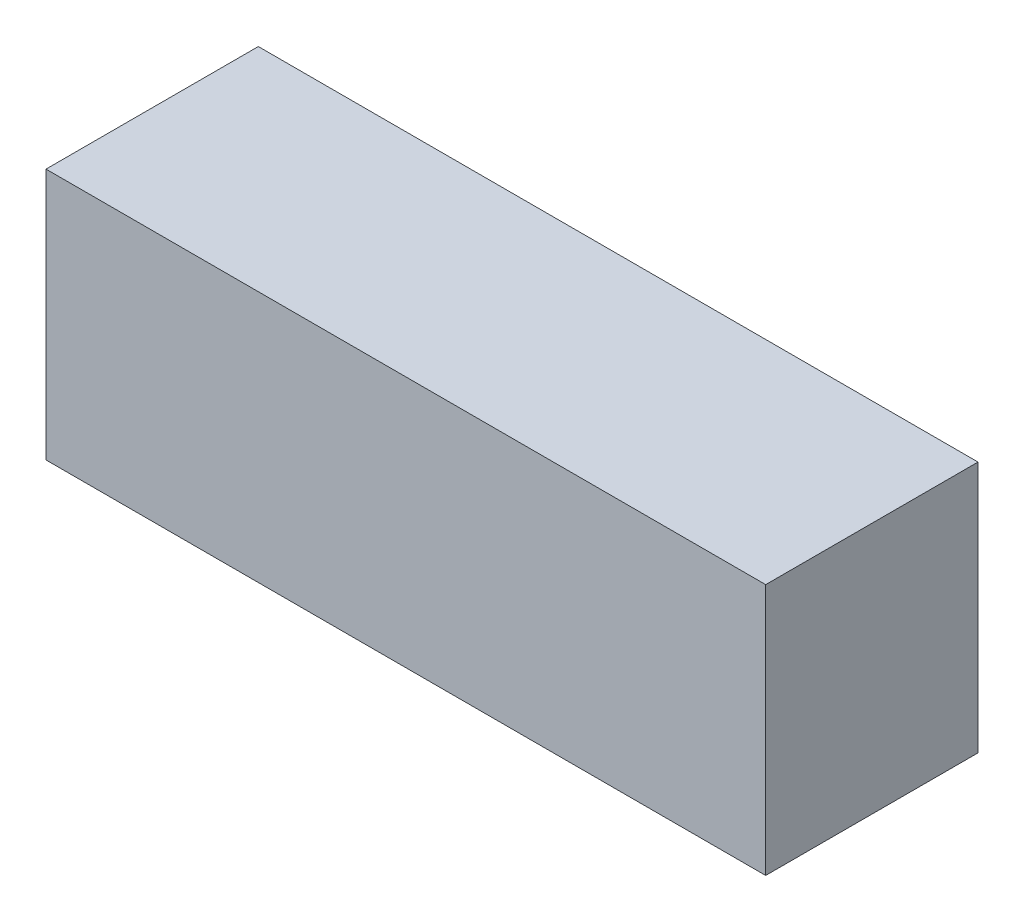
ISO-10303-21;
HEADER;
FILE_DESCRIPTION(('STEP AP214'),'2;1');
FILE_NAME('part.step','',(''),(''),'','','');
FILE_SCHEMA(('AUTOMOTIVE_DESIGN { 1 0 10303 214 1 1 1 1 }'));
ENDSEC;
DATA;
#1=APPLICATION_CONTEXT('core data for automotive mechanical design processes');
#2=APPLICATION_PROTOCOL_DEFINITION('international standard','automotive_design',2000,#1);
#3=PRODUCT_CONTEXT('',#1,'mechanical');
#4=PRODUCT('Part','Part','',(#3));
#5=PRODUCT_RELATED_PRODUCT_CATEGORY('part','',(#4));
#6=PRODUCT_DEFINITION_FORMATION('','',#4);
#7=PRODUCT_DEFINITION_CONTEXT('part definition',#1,'design');
#8=PRODUCT_DEFINITION('design','',#6,#7);
#9=PRODUCT_DEFINITION_SHAPE('','',#8);
#10=(LENGTH_UNIT() NAMED_UNIT(*) SI_UNIT(.MILLI.,.METRE.));
#11=(NAMED_UNIT(*) PLANE_ANGLE_UNIT() SI_UNIT($,.RADIAN.));
#12=(NAMED_UNIT(*) SI_UNIT($,.STERADIAN.) SOLID_ANGLE_UNIT());
#13=UNCERTAINTY_MEASURE_WITH_UNIT(LENGTH_MEASURE(1.E-05),#10,'distance_accuracy_value','');
#14=(GEOMETRIC_REPRESENTATION_CONTEXT(3) GLOBAL_UNCERTAINTY_ASSIGNED_CONTEXT((#13)) GLOBAL_UNIT_ASSIGNED_CONTEXT((#10,
#11,#12)) REPRESENTATION_CONTEXT('',''));
#15=CARTESIAN_POINT('',(0.,0.,0.));
#16=DIRECTION('',(0.,0.,1.));
#17=DIRECTION('',(1.,0.,0.));
#18=AXIS2_PLACEMENT_3D('',#15,#16,#17);
#19=CARTESIAN_POINT('',(-60.6361380554929,70.,59.));
#20=DIRECTION('',(0.,-1.,0.));
#21=DIRECTION('',(0.,0.,-1.));
#22=AXIS2_PLACEMENT_3D('',#19,#20,#21);
#23=PLANE('',#22);
#24=DIRECTION('',(-1.,0.,0.));
#25=VECTOR('',#24,1.);
#26=CARTESIAN_POINT('',(-60.6361380554929,70.,0.));
#27=LINE('',#26,#25);
#28=CARTESIAN_POINT('',(139.363861944507,70.,0.));
#29=VERTEX_POINT('',#28);
#30=CARTESIAN_POINT('',(-60.6361380554929,70.,0.));
#31=VERTEX_POINT('',#30);
#32=EDGE_CURVE('E179',#29,#31,#27,.T.);
#33=ORIENTED_EDGE('',*,*,#32,.T.);
#34=DIRECTION('',(0.,0.,-1.));
#35=VECTOR('',#34,1.);
#36=CARTESIAN_POINT('',(-60.6361380554929,70.,59.));
#37=LINE('',#36,#35);
#38=CARTESIAN_POINT('',(-60.6361380554929,70.,59.));
#39=VERTEX_POINT('',#38);
#40=EDGE_CURVE('E11',#39,#31,#37,.T.);
#41=ORIENTED_EDGE('',*,*,#40,.F.);
#42=DIRECTION('',(-1.,0.,0.));
#43=VECTOR('',#42,1.);
#44=CARTESIAN_POINT('',(-60.6361380554929,70.,59.));
#45=LINE('',#44,#43);
#46=CARTESIAN_POINT('',(139.363861944507,70.,59.));
#47=VERTEX_POINT('',#46);
#48=EDGE_CURVE('E227',#47,#39,#45,.T.);
#49=ORIENTED_EDGE('',*,*,#48,.F.);
#50=DIRECTION('',(0.,0.,-1.));
#51=VECTOR('',#50,1.);
#52=CARTESIAN_POINT('',(139.363861944507,70.,59.));
#53=LINE('',#52,#51);
#54=EDGE_CURVE('E241',#47,#29,#53,.T.);
#55=ORIENTED_EDGE('',*,*,#54,.T.);
#56=EDGE_LOOP('',(#33,#41,#49,#55));
#57=FACE_BOUND('',#56,.T.);
#58=ADVANCED_FACE('F45',(#57),#23,.F.);
#59=CARTESIAN_POINT('',(-60.6361380554929,70.,59.));
#60=DIRECTION('',(1.,0.,0.));
#61=DIRECTION('',(0.,1.,0.));
#62=AXIS2_PLACEMENT_3D('',#59,#60,#61);
#63=PLANE('',#62);
#64=DIRECTION('',(0.,-1.,0.));
#65=VECTOR('',#64,1.);
#66=CARTESIAN_POINT('',(-60.6361380554929,70.,0.));
#67=LINE('',#66,#65);
#68=CARTESIAN_POINT('',(-60.6361380554929,0.,0.));
#69=VERTEX_POINT('',#68);
#70=EDGE_CURVE('E245',#31,#69,#67,.T.);
#71=ORIENTED_EDGE('',*,*,#70,.T.);
#72=DIRECTION('',(0.,0.,-1.));
#73=VECTOR('',#72,1.);
#74=CARTESIAN_POINT('',(-60.6361380554929,0.,59.));
#75=LINE('',#74,#73);
#76=CARTESIAN_POINT('',(-60.6361380554929,0.,59.));
#77=VERTEX_POINT('',#76);
#78=EDGE_CURVE('E53',#77,#69,#75,.T.);
#79=ORIENTED_EDGE('',*,*,#78,.F.);
#80=DIRECTION('',(0.,-1.,0.));
#81=VECTOR('',#80,1.);
#82=CARTESIAN_POINT('',(-60.6361380554929,70.,59.));
#83=LINE('',#82,#81);
#84=EDGE_CURVE('E231',#39,#77,#83,.T.);
#85=ORIENTED_EDGE('',*,*,#84,.F.);
#86=ORIENTED_EDGE('',*,*,#40,.T.);
#87=EDGE_LOOP('',(#71,#79,#85,#86));
#88=FACE_BOUND('',#87,.T.);
#89=ADVANCED_FACE('F281',(#88),#63,.F.);
#90=CARTESIAN_POINT('',(-60.6361380554929,0.,59.));
#91=DIRECTION('',(0.,1.,0.));
#92=DIRECTION('',(0.,0.,1.));
#93=AXIS2_PLACEMENT_3D('',#90,#91,#92);
#94=PLANE('',#93);
#95=DIRECTION('',(1.,0.,0.));
#96=VECTOR('',#95,1.);
#97=CARTESIAN_POINT('',(-55.6361380554929,0.,17.185));
#98=LINE('',#97,#96);
#99=CARTESIAN_POINT('',(-55.6361380554929,0.,17.185));
#100=VERTEX_POINT('',#99);
#101=CARTESIAN_POINT('',(-20.6361380554929,0.,17.185));
#102=VERTEX_POINT('',#101);
#103=EDGE_CURVE('E170',#100,#102,#98,.T.);
#104=ORIENTED_EDGE('',*,*,#103,.F.);
#105=DIRECTION('',(0.,0.,-1.));
#106=VECTOR('',#105,1.);
#107=CARTESIAN_POINT('',(-55.6361380554929,0.,41.815));
#108=LINE('',#107,#106);
#109=CARTESIAN_POINT('',(-55.6361380554929,0.,41.815));
#110=VERTEX_POINT('',#109);
#111=EDGE_CURVE('E60',#110,#100,#108,.T.);
#112=ORIENTED_EDGE('',*,*,#111,.F.);
#113=DIRECTION('',(-1.,0.,0.));
#114=VECTOR('',#113,1.);
#115=CARTESIAN_POINT('',(-55.6361380554929,0.,41.815));
#116=LINE('',#115,#114);
#117=CARTESIAN_POINT('',(-20.6361380554929,0.,41.815));
#118=VERTEX_POINT('',#117);
#119=EDGE_CURVE('E157',#118,#110,#116,.T.);
#120=ORIENTED_EDGE('',*,*,#119,.F.);
#121=DIRECTION('',(0.,0.,1.));
#122=VECTOR('',#121,1.);
#123=CARTESIAN_POINT('',(-20.6361380554929,0.,41.815));
#124=LINE('',#123,#122);
#125=EDGE_CURVE('E161',#102,#118,#124,.T.);
#126=ORIENTED_EDGE('',*,*,#125,.F.);
#127=EDGE_LOOP('',(#104,#112,#120,#126));
#128=FACE_BOUND('',#127,.T.);
#129=DIRECTION('',(-1.,0.,0.));
#130=VECTOR('',#129,1.);
#131=CARTESIAN_POINT('',(134.363861944507,0.,41.815));
#132=LINE('',#131,#130);
#133=CARTESIAN_POINT('',(134.363861944507,0.,41.815));
#134=VERTEX_POINT('',#133);
#135=CARTESIAN_POINT('',(99.3638619445071,0.,41.815));
#136=VERTEX_POINT('',#135);
#137=EDGE_CURVE('E207',#134,#136,#132,.T.);
#138=ORIENTED_EDGE('',*,*,#137,.F.);
#139=DIRECTION('',(0.,0.,1.));
#140=VECTOR('',#139,1.);
#141=CARTESIAN_POINT('',(134.363861944507,0.,41.815));
#142=LINE('',#141,#140);
#143=CARTESIAN_POINT('',(134.363861944507,0.,17.185));
#144=VERTEX_POINT('',#143);
#145=EDGE_CURVE('E68',#144,#134,#142,.T.);
#146=ORIENTED_EDGE('',*,*,#145,.F.);
#147=DIRECTION('',(1.,0.,0.));
#148=VECTOR('',#147,1.);
#149=CARTESIAN_POINT('',(134.363861944507,0.,17.185));
#150=LINE('',#149,#148);
#151=CARTESIAN_POINT('',(99.3638619445071,0.,17.185));
#152=VERTEX_POINT('',#151);
#153=EDGE_CURVE('E198',#152,#144,#150,.T.);
#154=ORIENTED_EDGE('',*,*,#153,.F.);
#155=DIRECTION('',(0.,0.,-1.));
#156=VECTOR('',#155,1.);
#157=CARTESIAN_POINT('',(99.3638619445071,0.,41.815));
#158=LINE('',#157,#156);
#159=EDGE_CURVE('E202',#136,#152,#158,.T.);
#160=ORIENTED_EDGE('',*,*,#159,.F.);
#161=EDGE_LOOP('',(#138,#146,#154,#160));
#162=FACE_BOUND('',#161,.T.);
#163=DIRECTION('',(1.,0.,0.));
#164=VECTOR('',#163,1.);
#165=CARTESIAN_POINT('',(-60.6361380554929,0.,0.));
#166=LINE('',#165,#164);
#167=CARTESIAN_POINT('',(139.363861944507,0.,0.));
#168=VERTEX_POINT('',#167);
#169=EDGE_CURVE('E248',#69,#168,#166,.T.);
#170=ORIENTED_EDGE('',*,*,#169,.T.);
#171=DIRECTION('',(0.,0.,-1.));
#172=VECTOR('',#171,1.);
#173=CARTESIAN_POINT('',(139.363861944507,0.,59.));
#174=LINE('',#173,#172);
#175=CARTESIAN_POINT('',(139.363861944507,0.,59.));
#176=VERTEX_POINT('',#175);
#177=EDGE_CURVE('E256',#176,#168,#174,.T.);
#178=ORIENTED_EDGE('',*,*,#177,.F.);
#179=DIRECTION('',(1.,0.,0.));
#180=VECTOR('',#179,1.);
#181=CARTESIAN_POINT('',(-60.6361380554929,0.,59.));
#182=LINE('',#181,#180);
#183=EDGE_CURVE('E235',#77,#176,#182,.T.);
#184=ORIENTED_EDGE('',*,*,#183,.F.);
#185=ORIENTED_EDGE('',*,*,#78,.T.);
#186=EDGE_LOOP('',(#170,#178,#184,#185));
#187=FACE_BOUND('',#186,.T.);
#188=ADVANCED_FACE('F265',(#128,#162,#187),#94,.F.);
#189=CARTESIAN_POINT('',(139.363861944507,70.,59.));
#190=DIRECTION('',(-1.,0.,0.));
#191=DIRECTION('',(0.,0.,1.));
#192=AXIS2_PLACEMENT_3D('',#189,#190,#191);
#193=PLANE('',#192);
#194=DIRECTION('',(0.,1.,0.));
#195=VECTOR('',#194,1.);
#196=CARTESIAN_POINT('',(139.363861944507,70.,0.));
#197=LINE('',#196,#195);
#198=EDGE_CURVE('E232',#168,#29,#197,.T.);
#199=ORIENTED_EDGE('',*,*,#198,.T.);
#200=ORIENTED_EDGE('',*,*,#54,.F.);
#201=DIRECTION('',(0.,1.,0.));
#202=VECTOR('',#201,1.);
#203=CARTESIAN_POINT('',(139.363861944507,70.,59.));
#204=LINE('',#203,#202);
#205=EDGE_CURVE('E238',#176,#47,#204,.T.);
#206=ORIENTED_EDGE('',*,*,#205,.F.);
#207=ORIENTED_EDGE('',*,*,#177,.T.);
#208=EDGE_LOOP('',(#199,#200,#206,#207));
#209=FACE_BOUND('',#208,.T.);
#210=ADVANCED_FACE('F274',(#209),#193,.F.);
#211=CARTESIAN_POINT('',(0.,0.,59.));
#212=DIRECTION('',(0.,0.,-1.));
#213=DIRECTION('',(-1.,0.,0.));
#214=AXIS2_PLACEMENT_3D('',#211,#212,#213);
#215=PLANE('',#214);
#216=ORIENTED_EDGE('',*,*,#48,.T.);
#217=ORIENTED_EDGE('',*,*,#84,.T.);
#218=ORIENTED_EDGE('',*,*,#183,.T.);
#219=ORIENTED_EDGE('',*,*,#205,.T.);
#220=EDGE_LOOP('',(#216,#217,#218,#219));
#221=FACE_BOUND('',#220,.T.);
#222=ADVANCED_FACE('F280',(#221),#215,.F.);
#223=CARTESIAN_POINT('',(0.,0.,0.));
#224=DIRECTION('',(0.,0.,-1.));
#225=DIRECTION('',(-1.,0.,0.));
#226=AXIS2_PLACEMENT_3D('',#223,#224,#225);
#227=PLANE('',#226);
#228=ORIENTED_EDGE('',*,*,#32,.F.);
#229=ORIENTED_EDGE('',*,*,#198,.F.);
#230=ORIENTED_EDGE('',*,*,#169,.F.);
#231=ORIENTED_EDGE('',*,*,#70,.F.);
#232=EDGE_LOOP('',(#228,#229,#230,#231));
#233=FACE_BOUND('',#232,.T.);
#234=ADVANCED_FACE('F271',(#233),#227,.T.);
#235=CARTESIAN_POINT('',(134.363861944507,20.,41.815));
#236=DIRECTION('',(1.,0.,0.));
#237=DIRECTION('',(0.,0.,-1.));
#238=AXIS2_PLACEMENT_3D('',#235,#236,#237);
#239=PLANE('',#238);
#240=ORIENTED_EDGE('',*,*,#145,.T.);
#241=DIRECTION('',(0.,-1.,0.));
#242=VECTOR('',#241,1.);
#243=CARTESIAN_POINT('',(134.363861944507,20.,41.815));
#244=LINE('',#243,#242);
#245=CARTESIAN_POINT('',(134.363861944507,20.,41.815));
#246=VERTEX_POINT('',#245);
#247=EDGE_CURVE('E185',#246,#134,#244,.T.);
#248=ORIENTED_EDGE('',*,*,#247,.F.);
#249=DIRECTION('',(0.,0.,1.));
#250=VECTOR('',#249,1.);
#251=CARTESIAN_POINT('',(134.363861944507,20.,41.815));
#252=LINE('',#251,#250);
#253=CARTESIAN_POINT('',(134.363861944507,20.,17.185));
#254=VERTEX_POINT('',#253);
#255=EDGE_CURVE('E203',#254,#246,#252,.T.);
#256=ORIENTED_EDGE('',*,*,#255,.F.);
#257=DIRECTION('',(0.,-1.,0.));
#258=VECTOR('',#257,1.);
#259=CARTESIAN_POINT('',(134.363861944507,20.,17.185));
#260=LINE('',#259,#258);
#261=EDGE_CURVE('E195',#254,#144,#260,.T.);
#262=ORIENTED_EDGE('',*,*,#261,.T.);
#263=EDGE_LOOP('',(#240,#248,#256,#262));
#264=FACE_BOUND('',#263,.T.);
#265=ADVANCED_FACE('F294',(#264),#239,.F.);
#266=CARTESIAN_POINT('',(134.363861944507,20.,17.185));
#267=DIRECTION('',(0.,0.,-1.));
#268=DIRECTION('',(-1.,0.,0.));
#269=AXIS2_PLACEMENT_3D('',#266,#267,#268);
#270=PLANE('',#269);
#271=ORIENTED_EDGE('',*,*,#153,.T.);
#272=ORIENTED_EDGE('',*,*,#261,.F.);
#273=DIRECTION('',(1.,0.,0.));
#274=VECTOR('',#273,1.);
#275=CARTESIAN_POINT('',(134.363861944507,20.,17.185));
#276=LINE('',#275,#274);
#277=CARTESIAN_POINT('',(99.3638619445071,20.,17.185));
#278=VERTEX_POINT('',#277);
#279=EDGE_CURVE('E188',#278,#254,#276,.T.);
#280=ORIENTED_EDGE('',*,*,#279,.F.);
#281=DIRECTION('',(0.,-1.,0.));
#282=VECTOR('',#281,1.);
#283=CARTESIAN_POINT('',(99.3638619445071,20.,17.185));
#284=LINE('',#283,#282);
#285=EDGE_CURVE('E192',#278,#152,#284,.T.);
#286=ORIENTED_EDGE('',*,*,#285,.T.);
#287=EDGE_LOOP('',(#271,#272,#280,#286));
#288=FACE_BOUND('',#287,.T.);
#289=ADVANCED_FACE('F302',(#288),#270,.F.);
#290=CARTESIAN_POINT('',(99.3638619445071,20.,41.815));
#291=DIRECTION('',(-1.,0.,0.));
#292=DIRECTION('',(0.,0.,1.));
#293=AXIS2_PLACEMENT_3D('',#290,#291,#292);
#294=PLANE('',#293);
#295=ORIENTED_EDGE('',*,*,#159,.T.);
#296=ORIENTED_EDGE('',*,*,#285,.F.);
#297=DIRECTION('',(0.,0.,-1.));
#298=VECTOR('',#297,1.);
#299=CARTESIAN_POINT('',(99.3638619445071,20.,41.815));
#300=LINE('',#299,#298);
#301=CARTESIAN_POINT('',(99.3638619445071,20.,41.815));
#302=VERTEX_POINT('',#301);
#303=EDGE_CURVE('E216',#302,#278,#300,.T.);
#304=ORIENTED_EDGE('',*,*,#303,.F.);
#305=DIRECTION('',(0.,-1.,0.));
#306=VECTOR('',#305,1.);
#307=CARTESIAN_POINT('',(99.3638619445071,20.,41.815));
#308=LINE('',#307,#306);
#309=EDGE_CURVE('E189',#302,#136,#308,.T.);
#310=ORIENTED_EDGE('',*,*,#309,.T.);
#311=EDGE_LOOP('',(#295,#296,#304,#310));
#312=FACE_BOUND('',#311,.T.);
#313=ADVANCED_FACE('F305',(#312),#294,.F.);
#314=CARTESIAN_POINT('',(134.363861944507,20.,41.815));
#315=DIRECTION('',(0.,0.,1.));
#316=DIRECTION('',(1.,0.,0.));
#317=AXIS2_PLACEMENT_3D('',#314,#315,#316);
#318=PLANE('',#317);
#319=ORIENTED_EDGE('',*,*,#137,.T.);
#320=ORIENTED_EDGE('',*,*,#309,.F.);
#321=DIRECTION('',(-1.,0.,0.));
#322=VECTOR('',#321,1.);
#323=CARTESIAN_POINT('',(134.363861944507,20.,41.815));
#324=LINE('',#323,#322);
#325=EDGE_CURVE('E220',#246,#302,#324,.T.);
#326=ORIENTED_EDGE('',*,*,#325,.F.);
#327=ORIENTED_EDGE('',*,*,#247,.T.);
#328=EDGE_LOOP('',(#319,#320,#326,#327));
#329=FACE_BOUND('',#328,.T.);
#330=ADVANCED_FACE('F300',(#329),#318,.F.);
#331=CARTESIAN_POINT('',(0.,20.,0.));
#332=DIRECTION('',(0.,1.,0.));
#333=DIRECTION('',(0.,0.,1.));
#334=AXIS2_PLACEMENT_3D('',#331,#332,#333);
#335=PLANE('',#334);
#336=ORIENTED_EDGE('',*,*,#255,.T.);
#337=ORIENTED_EDGE('',*,*,#325,.T.);
#338=ORIENTED_EDGE('',*,*,#303,.T.);
#339=ORIENTED_EDGE('',*,*,#279,.T.);
#340=EDGE_LOOP('',(#336,#337,#338,#339));
#341=FACE_BOUND('',#340,.T.);
#342=ADVANCED_FACE('F297',(#341),#335,.F.);
#343=CARTESIAN_POINT('',(-55.6361380554929,20.,41.815));
#344=DIRECTION('',(-1.,0.,0.));
#345=DIRECTION('',(0.,0.,1.));
#346=AXIS2_PLACEMENT_3D('',#343,#344,#345);
#347=PLANE('',#346);
#348=ORIENTED_EDGE('',*,*,#111,.T.);
#349=DIRECTION('',(0.,-1.,0.));
#350=VECTOR('',#349,1.);
#351=CARTESIAN_POINT('',(-55.6361380554929,20.,17.185));
#352=LINE('',#351,#350);
#353=CARTESIAN_POINT('',(-55.6361380554929,20.,17.185));
#354=VERTEX_POINT('',#353);
#355=EDGE_CURVE('E132',#354,#100,#352,.T.);
#356=ORIENTED_EDGE('',*,*,#355,.F.);
#357=DIRECTION('',(0.,0.,-1.));
#358=VECTOR('',#357,1.);
#359=CARTESIAN_POINT('',(-55.6361380554929,20.,41.815));
#360=LINE('',#359,#358);
#361=CARTESIAN_POINT('',(-55.6361380554929,20.,41.815));
#362=VERTEX_POINT('',#361);
#363=EDGE_CURVE('E136',#362,#354,#360,.T.);
#364=ORIENTED_EDGE('',*,*,#363,.F.);
#365=DIRECTION('',(0.,-1.,0.));
#366=VECTOR('',#365,1.);
#367=CARTESIAN_POINT('',(-55.6361380554929,20.,41.815));
#368=LINE('',#367,#366);
#369=EDGE_CURVE('E176',#362,#110,#368,.T.);
#370=ORIENTED_EDGE('',*,*,#369,.T.);
#371=EDGE_LOOP('',(#348,#356,#364,#370));
#372=FACE_BOUND('',#371,.T.);
#373=ADVANCED_FACE('F134',(#372),#347,.F.);
#374=CARTESIAN_POINT('',(-55.6361380554929,20.,41.815));
#375=DIRECTION('',(0.,0.,1.));
#376=DIRECTION('',(1.,0.,0.));
#377=AXIS2_PLACEMENT_3D('',#374,#375,#376);
#378=PLANE('',#377);
#379=ORIENTED_EDGE('',*,*,#119,.T.);
#380=ORIENTED_EDGE('',*,*,#369,.F.);
#381=DIRECTION('',(-1.,0.,0.));
#382=VECTOR('',#381,1.);
#383=CARTESIAN_POINT('',(-55.6361380554929,20.,41.815));
#384=LINE('',#383,#382);
#385=CARTESIAN_POINT('',(-20.6361380554929,20.,41.815));
#386=VERTEX_POINT('',#385);
#387=EDGE_CURVE('E143',#386,#362,#384,.T.);
#388=ORIENTED_EDGE('',*,*,#387,.F.);
#389=DIRECTION('',(0.,-1.,0.));
#390=VECTOR('',#389,1.);
#391=CARTESIAN_POINT('',(-20.6361380554929,20.,41.815));
#392=LINE('',#391,#390);
#393=EDGE_CURVE('E180',#386,#118,#392,.T.);
#394=ORIENTED_EDGE('',*,*,#393,.T.);
#395=EDGE_LOOP('',(#379,#380,#388,#394));
#396=FACE_BOUND('',#395,.T.);
#397=ADVANCED_FACE('F317',(#396),#378,.F.);
#398=CARTESIAN_POINT('',(-20.6361380554929,20.,41.815));
#399=DIRECTION('',(1.,0.,0.));
#400=DIRECTION('',(0.,0.,-1.));
#401=AXIS2_PLACEMENT_3D('',#398,#399,#400);
#402=PLANE('',#401);
#403=ORIENTED_EDGE('',*,*,#125,.T.);
#404=ORIENTED_EDGE('',*,*,#393,.F.);
#405=DIRECTION('',(0.,0.,1.));
#406=VECTOR('',#405,1.);
#407=CARTESIAN_POINT('',(-20.6361380554929,20.,41.815));
#408=LINE('',#407,#406);
#409=CARTESIAN_POINT('',(-20.6361380554929,20.,17.185));
#410=VERTEX_POINT('',#409);
#411=EDGE_CURVE('E152',#410,#386,#408,.T.);
#412=ORIENTED_EDGE('',*,*,#411,.F.);
#413=DIRECTION('',(0.,-1.,0.));
#414=VECTOR('',#413,1.);
#415=CARTESIAN_POINT('',(-20.6361380554929,20.,17.185));
#416=LINE('',#415,#414);
#417=EDGE_CURVE('E142',#410,#102,#416,.T.);
#418=ORIENTED_EDGE('',*,*,#417,.T.);
#419=EDGE_LOOP('',(#403,#404,#412,#418));
#420=FACE_BOUND('',#419,.T.);
#421=ADVANCED_FACE('F320',(#420),#402,.F.);
#422=CARTESIAN_POINT('',(-55.6361380554929,20.,17.185));
#423=DIRECTION('',(0.,0.,-1.));
#424=DIRECTION('',(-1.,0.,0.));
#425=AXIS2_PLACEMENT_3D('',#422,#423,#424);
#426=PLANE('',#425);
#427=ORIENTED_EDGE('',*,*,#103,.T.);
#428=ORIENTED_EDGE('',*,*,#417,.F.);
#429=DIRECTION('',(1.,0.,0.));
#430=VECTOR('',#429,1.);
#431=CARTESIAN_POINT('',(-55.6361380554929,20.,17.185));
#432=LINE('',#431,#430);
#433=EDGE_CURVE('E146',#354,#410,#432,.T.);
#434=ORIENTED_EDGE('',*,*,#433,.F.);
#435=ORIENTED_EDGE('',*,*,#355,.T.);
#436=EDGE_LOOP('',(#427,#428,#434,#435));
#437=FACE_BOUND('',#436,.T.);
#438=ADVANCED_FACE('F147',(#437),#426,.F.);
#439=CARTESIAN_POINT('',(0.,20.,0.));
#440=DIRECTION('',(0.,-1.,0.));
#441=DIRECTION('',(0.,0.,-1.));
#442=AXIS2_PLACEMENT_3D('',#439,#440,#441);
#443=PLANE('',#442);
#444=ORIENTED_EDGE('',*,*,#363,.T.);
#445=ORIENTED_EDGE('',*,*,#433,.T.);
#446=ORIENTED_EDGE('',*,*,#411,.T.);
#447=ORIENTED_EDGE('',*,*,#387,.T.);
#448=EDGE_LOOP('',(#444,#445,#446,#447));
#449=FACE_BOUND('',#448,.T.);
#450=ADVANCED_FACE('F154',(#449),#443,.T.);
#451=CLOSED_SHELL('',(#58,#89,#188,#210,#222,#234,#265,#289,#313,#330,#342,#373,#397,#421,#438,#450));
#452=MANIFOLD_SOLID_BREP('B2',#451);
#453=ADVANCED_BREP_SHAPE_REPRESENTATION('',(#18,#452),#14);
#454=SHAPE_DEFINITION_REPRESENTATION(#9,#453);
ENDSEC;
END-ISO-10303-21;
